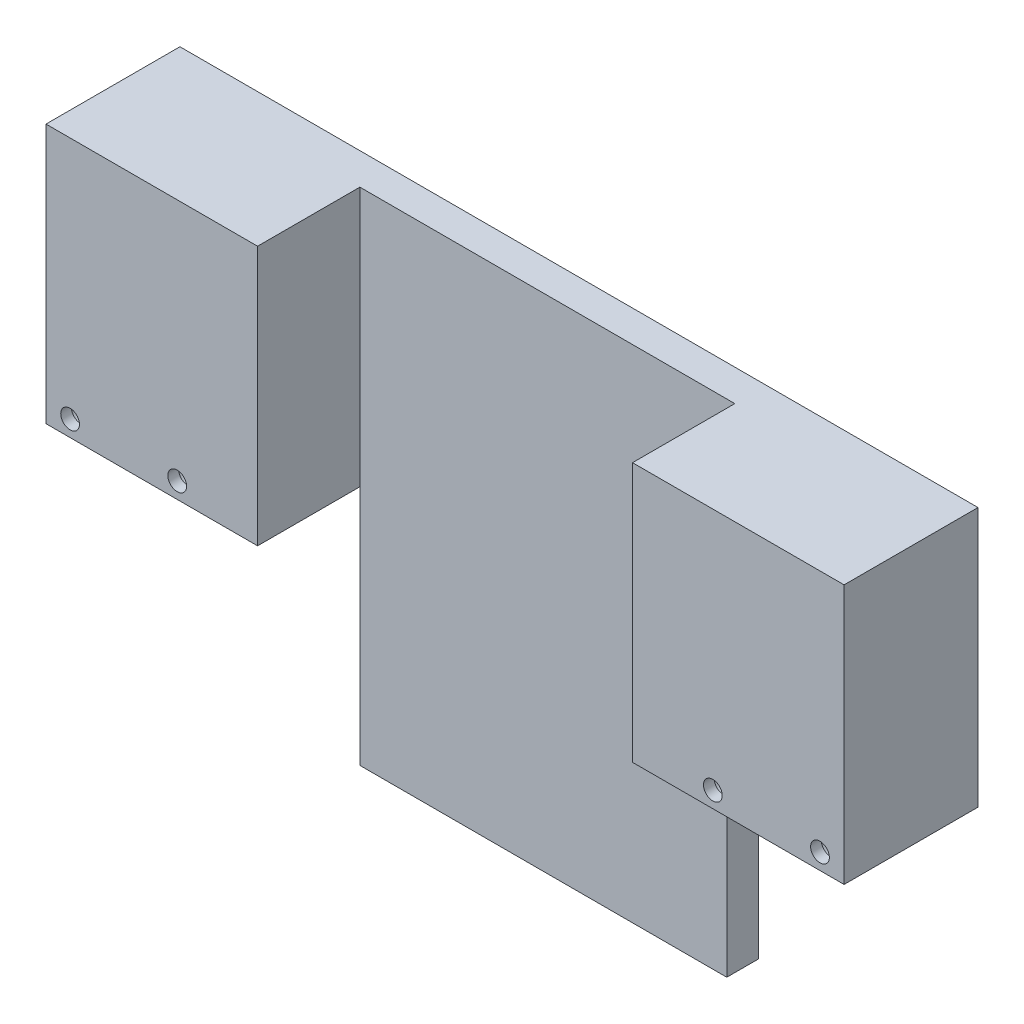
ISO-10303-21;
HEADER;
FILE_DESCRIPTION(('STEP AP214'),'2;1');
FILE_NAME('part.step','',(''),(''),'','','');
FILE_SCHEMA(('AUTOMOTIVE_DESIGN { 1 0 10303 214 1 1 1 1 }'));
ENDSEC;
DATA;
#1=APPLICATION_CONTEXT('core data for automotive mechanical design processes');
#2=APPLICATION_PROTOCOL_DEFINITION('international standard','automotive_design',2000,#1);
#3=PRODUCT_CONTEXT('',#1,'mechanical');
#4=PRODUCT('Part','Part','',(#3));
#5=PRODUCT_RELATED_PRODUCT_CATEGORY('part','',(#4));
#6=PRODUCT_DEFINITION_FORMATION('','',#4);
#7=PRODUCT_DEFINITION_CONTEXT('part definition',#1,'design');
#8=PRODUCT_DEFINITION('design','',#6,#7);
#9=PRODUCT_DEFINITION_SHAPE('','',#8);
#10=(LENGTH_UNIT() NAMED_UNIT(*) SI_UNIT(.MILLI.,.METRE.));
#11=(NAMED_UNIT(*) PLANE_ANGLE_UNIT() SI_UNIT($,.RADIAN.));
#12=(NAMED_UNIT(*) SI_UNIT($,.STERADIAN.) SOLID_ANGLE_UNIT());
#13=UNCERTAINTY_MEASURE_WITH_UNIT(LENGTH_MEASURE(1.E-05),#10,'distance_accuracy_value','');
#14=(GEOMETRIC_REPRESENTATION_CONTEXT(3) GLOBAL_UNCERTAINTY_ASSIGNED_CONTEXT((#13)) GLOBAL_UNIT_ASSIGNED_CONTEXT((#10,
#11,#12)) REPRESENTATION_CONTEXT('',''));
#15=CARTESIAN_POINT('',(0.,0.,0.));
#16=DIRECTION('',(0.,0.,1.));
#17=DIRECTION('',(1.,0.,0.));
#18=AXIS2_PLACEMENT_3D('',#15,#16,#17);
#19=CARTESIAN_POINT('',(74.5,11.9999999990341,2.95));
#20=DIRECTION('',(0.,-1.,0.));
#21=DIRECTION('',(0.,0.,-1.));
#22=AXIS2_PLACEMENT_3D('',#19,#20,#21);
#23=CONICAL_SURFACE('',#22,1.62099999948896,1.0297442574772);
#24=CARTESIAN_POINT('',(74.4999999999436,12.9739950647831,2.95));
#25=VERTEX_POINT('',#24);
#26=VERTEX_LOOP('',#25);
#27=FACE_BOUND('',#26,.T.);
#28=CARTESIAN_POINT('',(74.5,12.,2.95));
#29=DIRECTION('',(0.,-1.,0.));
#30=DIRECTION('',(1.,0.,0.));
#31=AXIS2_PLACEMENT_3D('',#28,#29,#30);
#32=CIRCLE('',#31,1.621);
#33=CARTESIAN_POINT('',(76.121,12.,2.95));
#34=VERTEX_POINT('',#33);
#35=EDGE_CURVE('E140',#34,#34,#32,.T.);
#36=ORIENTED_EDGE('',*,*,#35,.T.);
#37=EDGE_LOOP('',(#36));
#38=FACE_BOUND('',#37,.T.);
#39=ADVANCED_FACE('F16',(#27,#38),#23,.F.);
#40=CARTESIAN_POINT('',(4.50000000000001,48.05,189.174562050959));
#41=DIRECTION('',(0.,0.,-1.));
#42=DIRECTION('',(-1.,0.,0.));
#43=AXIS2_PLACEMENT_3D('',#40,#41,#42);
#44=CYLINDRICAL_SURFACE('',#43,1.75);
#45=CARTESIAN_POINT('',(4.50000000000001,48.05,23.));
#46=DIRECTION('',(0.,0.,-1.));
#47=DIRECTION('',(-1.,0.,0.));
#48=AXIS2_PLACEMENT_3D('',#45,#46,#47);
#49=CIRCLE('',#48,1.75);
#50=CARTESIAN_POINT('',(2.75000000000001,48.05,23.));
#51=VERTEX_POINT('',#50);
#52=EDGE_CURVE('E206',#51,#51,#49,.F.);
#53=ORIENTED_EDGE('',*,*,#52,.F.);
#54=EDGE_LOOP('',(#53));
#55=FACE_BOUND('',#54,.T.);
#56=CARTESIAN_POINT('',(4.50000000000001,48.05,25.));
#57=DIRECTION('',(0.,0.,-1.));
#58=DIRECTION('',(-1.,0.,0.));
#59=AXIS2_PLACEMENT_3D('',#56,#57,#58);
#60=CIRCLE('',#59,1.75);
#61=CARTESIAN_POINT('',(2.75000000000001,48.05,25.));
#62=VERTEX_POINT('',#61);
#63=EDGE_CURVE('E147',#62,#62,#60,.T.);
#64=ORIENTED_EDGE('',*,*,#63,.F.);
#65=EDGE_LOOP('',(#64));
#66=FACE_BOUND('',#65,.T.);
#67=ADVANCED_FACE('F231',(#55,#66),#44,.F.);
#68=CARTESIAN_POINT('',(24.5,48.05,189.174562050959));
#69=DIRECTION('',(0.,0.,-1.));
#70=DIRECTION('',(-1.,0.,0.));
#71=AXIS2_PLACEMENT_3D('',#68,#69,#70);
#72=CYLINDRICAL_SURFACE('',#71,1.75);
#73=CARTESIAN_POINT('',(24.5,48.05,23.));
#74=DIRECTION('',(0.,0.,-1.));
#75=DIRECTION('',(-1.,0.,0.));
#76=AXIS2_PLACEMENT_3D('',#73,#74,#75);
#77=CIRCLE('',#76,1.75);
#78=CARTESIAN_POINT('',(22.75,48.05,23.));
#79=VERTEX_POINT('',#78);
#80=EDGE_CURVE('E201',#79,#79,#77,.F.);
#81=ORIENTED_EDGE('',*,*,#80,.F.);
#82=EDGE_LOOP('',(#81));
#83=FACE_BOUND('',#82,.T.);
#84=CARTESIAN_POINT('',(24.5,48.05,25.));
#85=DIRECTION('',(0.,0.,-1.));
#86=DIRECTION('',(-1.,0.,0.));
#87=AXIS2_PLACEMENT_3D('',#84,#85,#86);
#88=CIRCLE('',#87,1.75);
#89=CARTESIAN_POINT('',(22.75,48.05,25.));
#90=VERTEX_POINT('',#89);
#91=EDGE_CURVE('E143',#90,#90,#88,.T.);
#92=ORIENTED_EDGE('',*,*,#91,.F.);
#93=EDGE_LOOP('',(#92));
#94=FACE_BOUND('',#93,.T.);
#95=ADVANCED_FACE('F233',(#83,#94),#72,.F.);
#96=CARTESIAN_POINT('',(124.5,48.05,189.174562050959));
#97=DIRECTION('',(0.,0.,-1.));
#98=DIRECTION('',(-1.,0.,0.));
#99=AXIS2_PLACEMENT_3D('',#96,#97,#98);
#100=CYLINDRICAL_SURFACE('',#99,1.75);
#101=CARTESIAN_POINT('',(124.5,48.05,23.));
#102=DIRECTION('',(0.,0.,-1.));
#103=DIRECTION('',(-1.,0.,0.));
#104=AXIS2_PLACEMENT_3D('',#101,#102,#103);
#105=CIRCLE('',#104,1.75);
#106=CARTESIAN_POINT('',(122.75,48.05,23.));
#107=VERTEX_POINT('',#106);
#108=EDGE_CURVE('E196',#107,#107,#105,.F.);
#109=ORIENTED_EDGE('',*,*,#108,.F.);
#110=EDGE_LOOP('',(#109));
#111=FACE_BOUND('',#110,.T.);
#112=CARTESIAN_POINT('',(124.5,48.05,25.));
#113=DIRECTION('',(0.,0.,-1.));
#114=DIRECTION('',(-1.,0.,0.));
#115=AXIS2_PLACEMENT_3D('',#112,#113,#114);
#116=CIRCLE('',#115,1.75);
#117=CARTESIAN_POINT('',(122.75,48.05,25.));
#118=VERTEX_POINT('',#117);
#119=EDGE_CURVE('E122',#118,#118,#116,.T.);
#120=ORIENTED_EDGE('',*,*,#119,.F.);
#121=EDGE_LOOP('',(#120));
#122=FACE_BOUND('',#121,.T.);
#123=ADVANCED_FACE('F240',(#111,#122),#100,.F.);
#124=CARTESIAN_POINT('',(144.5,48.05,189.174562050959));
#125=DIRECTION('',(0.,0.,-1.));
#126=DIRECTION('',(-1.,0.,0.));
#127=AXIS2_PLACEMENT_3D('',#124,#125,#126);
#128=CYLINDRICAL_SURFACE('',#127,1.75);
#129=CARTESIAN_POINT('',(144.5,48.05,23.));
#130=DIRECTION('',(0.,0.,-1.));
#131=DIRECTION('',(-1.,0.,0.));
#132=AXIS2_PLACEMENT_3D('',#129,#130,#131);
#133=CIRCLE('',#132,1.75);
#134=CARTESIAN_POINT('',(142.75,48.05,23.));
#135=VERTEX_POINT('',#134);
#136=EDGE_CURVE('E133',#135,#135,#133,.F.);
#137=ORIENTED_EDGE('',*,*,#136,.F.);
#138=EDGE_LOOP('',(#137));
#139=FACE_BOUND('',#138,.T.);
#140=CARTESIAN_POINT('',(144.5,48.05,25.));
#141=DIRECTION('',(0.,0.,-1.));
#142=DIRECTION('',(-1.,0.,0.));
#143=AXIS2_PLACEMENT_3D('',#140,#141,#142);
#144=CIRCLE('',#143,1.75);
#145=CARTESIAN_POINT('',(142.75,48.05,25.));
#146=VERTEX_POINT('',#145);
#147=EDGE_CURVE('E211',#146,#146,#144,.T.);
#148=ORIENTED_EDGE('',*,*,#147,.F.);
#149=EDGE_LOOP('',(#148));
#150=FACE_BOUND('',#149,.T.);
#151=ADVANCED_FACE('F334',(#139,#150),#128,.F.);
#152=CARTESIAN_POINT('',(39.5,93.5,25.));
#153=DIRECTION('',(-1.,0.,0.));
#154=DIRECTION('',(0.,0.,1.));
#155=AXIS2_PLACEMENT_3D('',#152,#153,#154);
#156=PLANE('',#155);
#157=DIRECTION('',(0.,1.,0.));
#158=VECTOR('',#157,1.);
#159=CARTESIAN_POINT('',(39.5,46.75,5.9));
#160=LINE('',#159,#158);
#161=CARTESIAN_POINT('',(39.5,93.5,5.9));
#162=VERTEX_POINT('',#161);
#163=CARTESIAN_POINT('',(39.5,45.05,5.9));
#164=VERTEX_POINT('',#163);
#165=EDGE_CURVE('E136',#162,#164,#160,.F.);
#166=ORIENTED_EDGE('',*,*,#165,.F.);
#167=DIRECTION('',(0.,0.,1.));
#168=VECTOR('',#167,1.);
#169=CARTESIAN_POINT('',(39.5,93.5,0.));
#170=LINE('',#169,#168);
#171=CARTESIAN_POINT('',(39.5,93.5,25.));
#172=VERTEX_POINT('',#171);
#173=EDGE_CURVE('E418',#172,#162,#170,.F.);
#174=ORIENTED_EDGE('',*,*,#173,.F.);
#175=DIRECTION('',(0.,1.,0.));
#176=VECTOR('',#175,1.);
#177=CARTESIAN_POINT('',(39.5,46.75,25.));
#178=LINE('',#177,#176);
#179=CARTESIAN_POINT('',(39.5,45.05,25.));
#180=VERTEX_POINT('',#179);
#181=EDGE_CURVE('E146',#180,#172,#178,.T.);
#182=ORIENTED_EDGE('',*,*,#181,.F.);
#183=DIRECTION('',(0.,0.,1.));
#184=VECTOR('',#183,1.);
#185=CARTESIAN_POINT('',(39.5,45.05,0.));
#186=LINE('',#185,#184);
#187=EDGE_CURVE('E410',#180,#164,#186,.F.);
#188=ORIENTED_EDGE('',*,*,#187,.T.);
#189=EDGE_LOOP('',(#166,#174,#182,#188));
#190=FACE_BOUND('',#189,.T.);
#191=ADVANCED_FACE('F330',(#190),#156,.F.);
#192=CARTESIAN_POINT('',(74.5,46.75,25.));
#193=DIRECTION('',(0.,0.,1.));
#194=DIRECTION('',(1.,0.,0.));
#195=AXIS2_PLACEMENT_3D('',#192,#193,#194);
#196=PLANE('',#195);
#197=ORIENTED_EDGE('',*,*,#91,.T.);
#198=EDGE_LOOP('',(#197));
#199=FACE_BOUND('',#198,.T.);
#200=ORIENTED_EDGE('',*,*,#63,.T.);
#201=EDGE_LOOP('',(#200));
#202=FACE_BOUND('',#201,.T.);
#203=DIRECTION('',(1.,0.,0.));
#204=VECTOR('',#203,1.);
#205=CARTESIAN_POINT('',(0.,93.5,25.));
#206=LINE('',#205,#204);
#207=CARTESIAN_POINT('',(0.,93.5,25.));
#208=VERTEX_POINT('',#207);
#209=EDGE_CURVE('E129',#208,#172,#206,.T.);
#210=ORIENTED_EDGE('',*,*,#209,.F.);
#211=DIRECTION('',(0.,1.,0.));
#212=VECTOR('',#211,1.);
#213=CARTESIAN_POINT('',(0.,0.,25.));
#214=LINE('',#213,#212);
#215=CARTESIAN_POINT('',(0.,45.05,25.));
#216=VERTEX_POINT('',#215);
#217=EDGE_CURVE('E415',#216,#208,#214,.T.);
#218=ORIENTED_EDGE('',*,*,#217,.F.);
#219=DIRECTION('',(1.,0.,0.));
#220=VECTOR('',#219,1.);
#221=CARTESIAN_POINT('',(0.,45.05,25.));
#222=LINE('',#221,#220);
#223=EDGE_CURVE('E404',#216,#180,#222,.T.);
#224=ORIENTED_EDGE('',*,*,#223,.T.);
#225=ORIENTED_EDGE('',*,*,#181,.T.);
#226=EDGE_LOOP('',(#210,#218,#224,#225));
#227=FACE_BOUND('',#226,.T.);
#228=ADVANCED_FACE('F228',(#199,#202,#227),#196,.T.);
#229=CARTESIAN_POINT('',(74.5,6.,2.95));
#230=DIRECTION('',(0.,-1.,0.));
#231=DIRECTION('',(1.,0.,0.));
#232=AXIS2_PLACEMENT_3D('',#229,#230,#231);
#233=CYLINDRICAL_SURFACE('',#232,1.621);
#234=ORIENTED_EDGE('',*,*,#35,.F.);
#235=EDGE_LOOP('',(#234));
#236=FACE_BOUND('',#235,.T.);
#237=CARTESIAN_POINT('',(74.5,0.,2.95));
#238=DIRECTION('',(0.,-1.,0.));
#239=DIRECTION('',(1.,0.,0.));
#240=AXIS2_PLACEMENT_3D('',#237,#238,#239);
#241=CIRCLE('',#240,1.621);
#242=CARTESIAN_POINT('',(76.121,0.,2.95));
#243=VERTEX_POINT('',#242);
#244=EDGE_CURVE('E187',#243,#243,#241,.F.);
#245=ORIENTED_EDGE('',*,*,#244,.F.);
#246=EDGE_LOOP('',(#245));
#247=FACE_BOUND('',#246,.T.);
#248=ADVANCED_FACE('F323',(#236,#247),#233,.F.);
#249=CARTESIAN_POINT('',(74.5,46.75,5.9));
#250=DIRECTION('',(0.,0.,1.));
#251=DIRECTION('',(1.,0.,0.));
#252=AXIS2_PLACEMENT_3D('',#249,#250,#251);
#253=PLANE('',#252);
#254=DIRECTION('',(1.,0.,0.));
#255=VECTOR('',#254,1.);
#256=CARTESIAN_POINT('',(149.,0.,5.9));
#257=LINE('',#256,#255);
#258=CARTESIAN_POINT('',(108.,0.,5.9));
#259=VERTEX_POINT('',#258);
#260=CARTESIAN_POINT('',(39.5,0.,5.9));
#261=VERTEX_POINT('',#260);
#262=EDGE_CURVE('E396',#259,#261,#257,.F.);
#263=ORIENTED_EDGE('',*,*,#262,.F.);
#264=DIRECTION('',(0.,1.,0.));
#265=VECTOR('',#264,1.);
#266=CARTESIAN_POINT('',(108.,0.,5.9));
#267=LINE('',#266,#265);
#268=CARTESIAN_POINT('',(108.,45.05,5.9));
#269=VERTEX_POINT('',#268);
#270=EDGE_CURVE('E391',#259,#269,#267,.T.);
#271=ORIENTED_EDGE('',*,*,#270,.T.);
#272=DIRECTION('',(1.,0.,0.));
#273=VECTOR('',#272,1.);
#274=CARTESIAN_POINT('',(74.5,45.05,5.9));
#275=LINE('',#274,#273);
#276=CARTESIAN_POINT('',(109.5,45.05,5.9));
#277=VERTEX_POINT('',#276);
#278=EDGE_CURVE('E138',#269,#277,#275,.T.);
#279=ORIENTED_EDGE('',*,*,#278,.T.);
#280=DIRECTION('',(0.,1.,0.));
#281=VECTOR('',#280,1.);
#282=CARTESIAN_POINT('',(109.5,0.,5.9));
#283=LINE('',#282,#281);
#284=CARTESIAN_POINT('',(109.5,93.5,5.9));
#285=VERTEX_POINT('',#284);
#286=EDGE_CURVE('E123',#277,#285,#283,.T.);
#287=ORIENTED_EDGE('',*,*,#286,.T.);
#288=DIRECTION('',(1.,0.,0.));
#289=VECTOR('',#288,1.);
#290=CARTESIAN_POINT('',(0.,93.5,5.9));
#291=LINE('',#290,#289);
#292=EDGE_CURVE('E109',#162,#285,#291,.T.);
#293=ORIENTED_EDGE('',*,*,#292,.F.);
#294=ORIENTED_EDGE('',*,*,#165,.T.);
#295=DIRECTION('',(0.,1.,0.));
#296=VECTOR('',#295,1.);
#297=CARTESIAN_POINT('',(39.5,45.05,5.9));
#298=LINE('',#297,#296);
#299=EDGE_CURVE('E398',#164,#261,#298,.F.);
#300=ORIENTED_EDGE('',*,*,#299,.T.);
#301=EDGE_LOOP('',(#263,#271,#279,#287,#293,#294,#300));
#302=FACE_BOUND('',#301,.T.);
#303=ADVANCED_FACE('F320',(#302),#253,.T.);
#304=CARTESIAN_POINT('',(109.5,0.,25.));
#305=DIRECTION('',(1.,0.,0.));
#306=DIRECTION('',(0.,0.,-1.));
#307=AXIS2_PLACEMENT_3D('',#304,#305,#306);
#308=PLANE('',#307);
#309=DIRECTION('',(0.,1.,0.));
#310=VECTOR('',#309,1.);
#311=CARTESIAN_POINT('',(109.5,46.75,25.));
#312=LINE('',#311,#310);
#313=CARTESIAN_POINT('',(109.5,93.5,25.));
#314=VERTEX_POINT('',#313);
#315=CARTESIAN_POINT('',(109.5,45.05,25.));
#316=VERTEX_POINT('',#315);
#317=EDGE_CURVE('E115',#314,#316,#312,.F.);
#318=ORIENTED_EDGE('',*,*,#317,.F.);
#319=DIRECTION('',(0.,0.,1.));
#320=VECTOR('',#319,1.);
#321=CARTESIAN_POINT('',(109.5,93.5,0.));
#322=LINE('',#321,#320);
#323=EDGE_CURVE('E102',#285,#314,#322,.T.);
#324=ORIENTED_EDGE('',*,*,#323,.F.);
#325=ORIENTED_EDGE('',*,*,#286,.F.);
#326=DIRECTION('',(0.,0.,1.));
#327=VECTOR('',#326,1.);
#328=CARTESIAN_POINT('',(109.5,45.05,0.));
#329=LINE('',#328,#327);
#330=EDGE_CURVE('E118',#277,#316,#329,.T.);
#331=ORIENTED_EDGE('',*,*,#330,.T.);
#332=EDGE_LOOP('',(#318,#324,#325,#331));
#333=FACE_BOUND('',#332,.T.);
#334=ADVANCED_FACE('F116',(#333),#308,.F.);
#335=CARTESIAN_POINT('',(74.5,46.75,25.));
#336=DIRECTION('',(0.,0.,1.));
#337=DIRECTION('',(1.,0.,0.));
#338=AXIS2_PLACEMENT_3D('',#335,#336,#337);
#339=PLANE('',#338);
#340=ORIENTED_EDGE('',*,*,#147,.T.);
#341=EDGE_LOOP('',(#340));
#342=FACE_BOUND('',#341,.T.);
#343=ORIENTED_EDGE('',*,*,#119,.T.);
#344=EDGE_LOOP('',(#343));
#345=FACE_BOUND('',#344,.T.);
#346=DIRECTION('',(1.,0.,0.));
#347=VECTOR('',#346,1.);
#348=CARTESIAN_POINT('',(0.,93.5,25.));
#349=LINE('',#348,#347);
#350=CARTESIAN_POINT('',(149.,93.5,25.));
#351=VERTEX_POINT('',#350);
#352=EDGE_CURVE('E106',#314,#351,#349,.T.);
#353=ORIENTED_EDGE('',*,*,#352,.F.);
#354=ORIENTED_EDGE('',*,*,#317,.T.);
#355=DIRECTION('',(1.,0.,0.));
#356=VECTOR('',#355,1.);
#357=CARTESIAN_POINT('',(108.,45.05,25.));
#358=LINE('',#357,#356);
#359=CARTESIAN_POINT('',(149.,45.05,25.));
#360=VERTEX_POINT('',#359);
#361=EDGE_CURVE('E388',#316,#360,#358,.T.);
#362=ORIENTED_EDGE('',*,*,#361,.T.);
#363=DIRECTION('',(0.,1.,0.));
#364=VECTOR('',#363,1.);
#365=CARTESIAN_POINT('',(149.,93.5,25.));
#366=LINE('',#365,#364);
#367=EDGE_CURVE('E112',#351,#360,#366,.F.);
#368=ORIENTED_EDGE('',*,*,#367,.F.);
#369=EDGE_LOOP('',(#353,#354,#362,#368));
#370=FACE_BOUND('',#369,.T.);
#371=ADVANCED_FACE('F125',(#342,#345,#370),#339,.T.);
#372=CARTESIAN_POINT('',(4.50000000000001,48.05,23.));
#373=DIRECTION('',(0.,0.,-1.));
#374=DIRECTION('',(-1.,0.,0.));
#375=AXIS2_PLACEMENT_3D('',#372,#373,#374);
#376=PLANE('',#375);
#377=ORIENTED_EDGE('',*,*,#52,.T.);
#378=EDGE_LOOP('',(#377));
#379=FACE_BOUND('',#378,.T.);
#380=CARTESIAN_POINT('',(4.50000000000001,48.05,23.));
#381=DIRECTION('',(0.,0.,-1.));
#382=DIRECTION('',(-1.,0.,0.));
#383=AXIS2_PLACEMENT_3D('',#380,#381,#382);
#384=CIRCLE('',#383,2.875);
#385=CARTESIAN_POINT('',(1.62500000000001,48.05,23.));
#386=VERTEX_POINT('',#385);
#387=EDGE_CURVE('E180',#386,#386,#384,.T.);
#388=ORIENTED_EDGE('',*,*,#387,.T.);
#389=EDGE_LOOP('',(#388));
#390=FACE_BOUND('',#389,.T.);
#391=ADVANCED_FACE('F310',(#379,#390),#376,.T.);
#392=CARTESIAN_POINT('',(24.5,48.05,23.));
#393=DIRECTION('',(0.,0.,-1.));
#394=DIRECTION('',(-1.,0.,0.));
#395=AXIS2_PLACEMENT_3D('',#392,#393,#394);
#396=PLANE('',#395);
#397=ORIENTED_EDGE('',*,*,#80,.T.);
#398=EDGE_LOOP('',(#397));
#399=FACE_BOUND('',#398,.T.);
#400=CARTESIAN_POINT('',(24.5,48.05,23.));
#401=DIRECTION('',(0.,0.,-1.));
#402=DIRECTION('',(-1.,0.,0.));
#403=AXIS2_PLACEMENT_3D('',#400,#401,#402);
#404=CIRCLE('',#403,2.875);
#405=CARTESIAN_POINT('',(21.625,48.05,23.));
#406=VERTEX_POINT('',#405);
#407=EDGE_CURVE('E175',#406,#406,#404,.T.);
#408=ORIENTED_EDGE('',*,*,#407,.T.);
#409=EDGE_LOOP('',(#408));
#410=FACE_BOUND('',#409,.T.);
#411=ADVANCED_FACE('F306',(#399,#410),#396,.T.);
#412=CARTESIAN_POINT('',(124.5,48.05,23.));
#413=DIRECTION('',(0.,0.,-1.));
#414=DIRECTION('',(-1.,0.,0.));
#415=AXIS2_PLACEMENT_3D('',#412,#413,#414);
#416=PLANE('',#415);
#417=ORIENTED_EDGE('',*,*,#108,.T.);
#418=EDGE_LOOP('',(#417));
#419=FACE_BOUND('',#418,.T.);
#420=CARTESIAN_POINT('',(124.5,48.05,23.));
#421=DIRECTION('',(0.,0.,-1.));
#422=DIRECTION('',(-1.,0.,0.));
#423=AXIS2_PLACEMENT_3D('',#420,#421,#422);
#424=CIRCLE('',#423,2.875);
#425=CARTESIAN_POINT('',(121.625,48.05,23.));
#426=VERTEX_POINT('',#425);
#427=EDGE_CURVE('E170',#426,#426,#424,.T.);
#428=ORIENTED_EDGE('',*,*,#427,.T.);
#429=EDGE_LOOP('',(#428));
#430=FACE_BOUND('',#429,.T.);
#431=ADVANCED_FACE('F302',(#419,#430),#416,.T.);
#432=CARTESIAN_POINT('',(144.5,48.05,23.));
#433=DIRECTION('',(0.,0.,-1.));
#434=DIRECTION('',(-1.,0.,0.));
#435=AXIS2_PLACEMENT_3D('',#432,#433,#434);
#436=PLANE('',#435);
#437=ORIENTED_EDGE('',*,*,#136,.T.);
#438=EDGE_LOOP('',(#437));
#439=FACE_BOUND('',#438,.T.);
#440=CARTESIAN_POINT('',(144.5,48.05,23.));
#441=DIRECTION('',(0.,0.,-1.));
#442=DIRECTION('',(-1.,0.,0.));
#443=AXIS2_PLACEMENT_3D('',#440,#441,#442);
#444=CIRCLE('',#443,2.875);
#445=CARTESIAN_POINT('',(141.625,48.05,23.));
#446=VERTEX_POINT('',#445);
#447=EDGE_CURVE('E166',#446,#446,#444,.T.);
#448=ORIENTED_EDGE('',*,*,#447,.T.);
#449=EDGE_LOOP('',(#448));
#450=FACE_BOUND('',#449,.T.);
#451=ADVANCED_FACE('F298',(#439,#450),#436,.T.);
#452=CARTESIAN_POINT('',(149.,93.5,0.));
#453=DIRECTION('',(1.,0.,0.));
#454=DIRECTION('',(0.,0.,-1.));
#455=AXIS2_PLACEMENT_3D('',#452,#453,#454);
#456=PLANE('',#455);
#457=DIRECTION('',(0.,0.,1.));
#458=VECTOR('',#457,1.);
#459=CARTESIAN_POINT('',(149.,93.5,0.));
#460=LINE('',#459,#458);
#461=CARTESIAN_POINT('',(149.,93.5,0.));
#462=VERTEX_POINT('',#461);
#463=EDGE_CURVE('E127',#351,#462,#460,.F.);
#464=ORIENTED_EDGE('',*,*,#463,.F.);
#465=ORIENTED_EDGE('',*,*,#367,.T.);
#466=DIRECTION('',(0.,0.,1.));
#467=VECTOR('',#466,1.);
#468=CARTESIAN_POINT('',(149.,45.05,0.));
#469=LINE('',#468,#467);
#470=CARTESIAN_POINT('',(149.,45.05,0.));
#471=VERTEX_POINT('',#470);
#472=EDGE_CURVE('E385',#360,#471,#469,.F.);
#473=ORIENTED_EDGE('',*,*,#472,.T.);
#474=DIRECTION('',(0.,1.,0.));
#475=VECTOR('',#474,1.);
#476=CARTESIAN_POINT('',(149.,46.75,0.));
#477=LINE('',#476,#475);
#478=EDGE_CURVE('E169',#471,#462,#477,.T.);
#479=ORIENTED_EDGE('',*,*,#478,.T.);
#480=EDGE_LOOP('',(#464,#465,#473,#479));
#481=FACE_BOUND('',#480,.T.);
#482=ADVANCED_FACE('F295',(#481),#456,.T.);
#483=CARTESIAN_POINT('',(0.,93.5,0.));
#484=DIRECTION('',(0.,1.,0.));
#485=DIRECTION('',(0.,0.,1.));
#486=AXIS2_PLACEMENT_3D('',#483,#484,#485);
#487=PLANE('',#486);
#488=ORIENTED_EDGE('',*,*,#173,.T.);
#489=ORIENTED_EDGE('',*,*,#292,.T.);
#490=ORIENTED_EDGE('',*,*,#323,.T.);
#491=ORIENTED_EDGE('',*,*,#352,.T.);
#492=ORIENTED_EDGE('',*,*,#463,.T.);
#493=DIRECTION('',(1.,0.,0.));
#494=VECTOR('',#493,1.);
#495=CARTESIAN_POINT('',(74.5,93.5,0.));
#496=LINE('',#495,#494);
#497=CARTESIAN_POINT('',(0.,93.5,0.));
#498=VERTEX_POINT('',#497);
#499=EDGE_CURVE('E379',#462,#498,#496,.F.);
#500=ORIENTED_EDGE('',*,*,#499,.T.);
#501=DIRECTION('',(0.,0.,1.));
#502=VECTOR('',#501,1.);
#503=CARTESIAN_POINT('',(0.,93.5,0.));
#504=LINE('',#503,#502);
#505=EDGE_CURVE('E413',#208,#498,#504,.F.);
#506=ORIENTED_EDGE('',*,*,#505,.F.);
#507=ORIENTED_EDGE('',*,*,#209,.T.);
#508=EDGE_LOOP('',(#488,#489,#490,#491,#492,#500,#506,#507));
#509=FACE_BOUND('',#508,.T.);
#510=ADVANCED_FACE('F104',(#509),#487,.T.);
#511=CARTESIAN_POINT('',(0.,0.,0.));
#512=DIRECTION('',(-1.,0.,0.));
#513=DIRECTION('',(0.,0.,1.));
#514=AXIS2_PLACEMENT_3D('',#511,#512,#513);
#515=PLANE('',#514);
#516=ORIENTED_EDGE('',*,*,#505,.T.);
#517=DIRECTION('',(0.,1.,0.));
#518=VECTOR('',#517,1.);
#519=CARTESIAN_POINT('',(0.,46.75,0.));
#520=LINE('',#519,#518);
#521=CARTESIAN_POINT('',(0.,45.05,0.));
#522=VERTEX_POINT('',#521);
#523=EDGE_CURVE('E376',#498,#522,#520,.F.);
#524=ORIENTED_EDGE('',*,*,#523,.T.);
#525=DIRECTION('',(0.,0.,1.));
#526=VECTOR('',#525,1.);
#527=CARTESIAN_POINT('',(0.,45.05,0.));
#528=LINE('',#527,#526);
#529=EDGE_CURVE('E407',#522,#216,#528,.T.);
#530=ORIENTED_EDGE('',*,*,#529,.T.);
#531=ORIENTED_EDGE('',*,*,#217,.T.);
#532=EDGE_LOOP('',(#516,#524,#530,#531));
#533=FACE_BOUND('',#532,.T.);
#534=ADVANCED_FACE('F288',(#533),#515,.T.);
#535=CARTESIAN_POINT('',(0.,45.05,0.));
#536=DIRECTION('',(0.,1.,0.));
#537=DIRECTION('',(0.,0.,1.));
#538=AXIS2_PLACEMENT_3D('',#535,#536,#537);
#539=PLANE('',#538);
#540=ORIENTED_EDGE('',*,*,#529,.F.);
#541=DIRECTION('',(1.,0.,0.));
#542=VECTOR('',#541,1.);
#543=CARTESIAN_POINT('',(74.5,45.05,0.));
#544=LINE('',#543,#542);
#545=CARTESIAN_POINT('',(39.5,45.05,0.));
#546=VERTEX_POINT('',#545);
#547=EDGE_CURVE('E370',#522,#546,#544,.T.);
#548=ORIENTED_EDGE('',*,*,#547,.T.);
#549=DIRECTION('',(0.,0.,-1.));
#550=VECTOR('',#549,1.);
#551=CARTESIAN_POINT('',(39.5,45.05,0.));
#552=LINE('',#551,#550);
#553=EDGE_CURVE('E401',#546,#164,#552,.F.);
#554=ORIENTED_EDGE('',*,*,#553,.T.);
#555=ORIENTED_EDGE('',*,*,#187,.F.);
#556=ORIENTED_EDGE('',*,*,#223,.F.);
#557=EDGE_LOOP('',(#540,#548,#554,#555,#556));
#558=FACE_BOUND('',#557,.T.);
#559=ADVANCED_FACE('F284',(#558),#539,.F.);
#560=CARTESIAN_POINT('',(39.5,45.05,0.));
#561=DIRECTION('',(1.,0.,0.));
#562=DIRECTION('',(0.,0.,-1.));
#563=AXIS2_PLACEMENT_3D('',#560,#561,#562);
#564=PLANE('',#563);
#565=ORIENTED_EDGE('',*,*,#553,.F.);
#566=DIRECTION('',(0.,1.,0.));
#567=VECTOR('',#566,1.);
#568=CARTESIAN_POINT('',(39.5,46.75,0.));
#569=LINE('',#568,#567);
#570=CARTESIAN_POINT('',(39.5,0.,0.));
#571=VERTEX_POINT('',#570);
#572=EDGE_CURVE('E368',#546,#571,#569,.F.);
#573=ORIENTED_EDGE('',*,*,#572,.T.);
#574=DIRECTION('',(0.,0.,-1.));
#575=VECTOR('',#574,1.);
#576=CARTESIAN_POINT('',(39.5,0.,0.));
#577=LINE('',#576,#575);
#578=EDGE_CURVE('E191',#261,#571,#577,.T.);
#579=ORIENTED_EDGE('',*,*,#578,.F.);
#580=ORIENTED_EDGE('',*,*,#299,.F.);
#581=EDGE_LOOP('',(#565,#573,#579,#580));
#582=FACE_BOUND('',#581,.T.);
#583=ADVANCED_FACE('F280',(#582),#564,.F.);
#584=CARTESIAN_POINT('',(149.,0.,0.));
#585=DIRECTION('',(0.,-1.,0.));
#586=DIRECTION('',(0.,0.,-1.));
#587=AXIS2_PLACEMENT_3D('',#584,#585,#586);
#588=PLANE('',#587);
#589=ORIENTED_EDGE('',*,*,#244,.T.);
#590=EDGE_LOOP('',(#589));
#591=FACE_BOUND('',#590,.T.);
#592=ORIENTED_EDGE('',*,*,#578,.T.);
#593=DIRECTION('',(1.,0.,0.));
#594=VECTOR('',#593,1.);
#595=CARTESIAN_POINT('',(74.5,0.,0.));
#596=LINE('',#595,#594);
#597=CARTESIAN_POINT('',(108.,0.,0.));
#598=VERTEX_POINT('',#597);
#599=EDGE_CURVE('E362',#571,#598,#596,.T.);
#600=ORIENTED_EDGE('',*,*,#599,.T.);
#601=DIRECTION('',(0.,0.,1.));
#602=VECTOR('',#601,1.);
#603=CARTESIAN_POINT('',(108.,0.,0.));
#604=LINE('',#603,#602);
#605=EDGE_CURVE('E190',#598,#259,#604,.T.);
#606=ORIENTED_EDGE('',*,*,#605,.T.);
#607=ORIENTED_EDGE('',*,*,#262,.T.);
#608=EDGE_LOOP('',(#592,#600,#606,#607));
#609=FACE_BOUND('',#608,.T.);
#610=ADVANCED_FACE('F276',(#591,#609),#588,.T.);
#611=CARTESIAN_POINT('',(108.,0.,0.));
#612=DIRECTION('',(-1.,0.,0.));
#613=DIRECTION('',(0.,0.,1.));
#614=AXIS2_PLACEMENT_3D('',#611,#612,#613);
#615=PLANE('',#614);
#616=ORIENTED_EDGE('',*,*,#605,.F.);
#617=DIRECTION('',(0.,1.,0.));
#618=VECTOR('',#617,1.);
#619=CARTESIAN_POINT('',(108.,46.75,0.));
#620=LINE('',#619,#618);
#621=CARTESIAN_POINT('',(108.,45.05,0.));
#622=VERTEX_POINT('',#621);
#623=EDGE_CURVE('E359',#598,#622,#620,.T.);
#624=ORIENTED_EDGE('',*,*,#623,.T.);
#625=DIRECTION('',(0.,0.,1.));
#626=VECTOR('',#625,1.);
#627=CARTESIAN_POINT('',(108.,45.05,0.));
#628=LINE('',#627,#626);
#629=EDGE_CURVE('E34',#622,#269,#628,.T.);
#630=ORIENTED_EDGE('',*,*,#629,.T.);
#631=ORIENTED_EDGE('',*,*,#270,.F.);
#632=EDGE_LOOP('',(#616,#624,#630,#631));
#633=FACE_BOUND('',#632,.T.);
#634=ADVANCED_FACE('F273',(#633),#615,.F.);
#635=CARTESIAN_POINT('',(108.,45.05,0.));
#636=DIRECTION('',(0.,1.,0.));
#637=DIRECTION('',(0.,0.,1.));
#638=AXIS2_PLACEMENT_3D('',#635,#636,#637);
#639=PLANE('',#638);
#640=ORIENTED_EDGE('',*,*,#629,.F.);
#641=DIRECTION('',(1.,0.,0.));
#642=VECTOR('',#641,1.);
#643=CARTESIAN_POINT('',(74.5,45.05,0.));
#644=LINE('',#643,#642);
#645=EDGE_CURVE('E163',#622,#471,#644,.T.);
#646=ORIENTED_EDGE('',*,*,#645,.T.);
#647=ORIENTED_EDGE('',*,*,#472,.F.);
#648=ORIENTED_EDGE('',*,*,#361,.F.);
#649=ORIENTED_EDGE('',*,*,#330,.F.);
#650=ORIENTED_EDGE('',*,*,#278,.F.);
#651=EDGE_LOOP('',(#640,#646,#647,#648,#649,#650));
#652=FACE_BOUND('',#651,.T.);
#653=ADVANCED_FACE('F269',(#652),#639,.F.);
#654=CARTESIAN_POINT('',(4.50000000000001,48.05,11.5));
#655=DIRECTION('',(0.,0.,-1.));
#656=DIRECTION('',(-1.,0.,0.));
#657=AXIS2_PLACEMENT_3D('',#654,#655,#656);
#658=CYLINDRICAL_SURFACE('',#657,2.875);
#659=ORIENTED_EDGE('',*,*,#387,.F.);
#660=EDGE_LOOP('',(#659));
#661=FACE_BOUND('',#660,.T.);
#662=CARTESIAN_POINT('',(4.50000000000001,48.05,0.));
#663=DIRECTION('',(0.,0.,-1.));
#664=DIRECTION('',(-1.,0.,0.));
#665=AXIS2_PLACEMENT_3D('',#662,#663,#664);
#666=CIRCLE('',#665,2.875);
#667=CARTESIAN_POINT('',(1.62500000000001,48.05,0.));
#668=VERTEX_POINT('',#667);
#669=EDGE_CURVE('E158',#668,#668,#666,.T.);
#670=ORIENTED_EDGE('',*,*,#669,.T.);
#671=EDGE_LOOP('',(#670));
#672=FACE_BOUND('',#671,.T.);
#673=ADVANCED_FACE('F265',(#661,#672),#658,.F.);
#674=CARTESIAN_POINT('',(24.5,48.05,11.5));
#675=DIRECTION('',(0.,0.,-1.));
#676=DIRECTION('',(-1.,0.,0.));
#677=AXIS2_PLACEMENT_3D('',#674,#675,#676);
#678=CYLINDRICAL_SURFACE('',#677,2.875);
#679=ORIENTED_EDGE('',*,*,#407,.F.);
#680=EDGE_LOOP('',(#679));
#681=FACE_BOUND('',#680,.T.);
#682=CARTESIAN_POINT('',(24.5,48.05,0.));
#683=DIRECTION('',(0.,0.,-1.));
#684=DIRECTION('',(-1.,0.,0.));
#685=AXIS2_PLACEMENT_3D('',#682,#683,#684);
#686=CIRCLE('',#685,2.875);
#687=CARTESIAN_POINT('',(21.625,48.05,0.));
#688=VERTEX_POINT('',#687);
#689=EDGE_CURVE('E153',#688,#688,#686,.T.);
#690=ORIENTED_EDGE('',*,*,#689,.T.);
#691=EDGE_LOOP('',(#690));
#692=FACE_BOUND('',#691,.T.);
#693=ADVANCED_FACE('F261',(#681,#692),#678,.F.);
#694=CARTESIAN_POINT('',(124.5,48.05,11.5));
#695=DIRECTION('',(0.,0.,-1.));
#696=DIRECTION('',(-1.,0.,0.));
#697=AXIS2_PLACEMENT_3D('',#694,#695,#696);
#698=CYLINDRICAL_SURFACE('',#697,2.875);
#699=ORIENTED_EDGE('',*,*,#427,.F.);
#700=EDGE_LOOP('',(#699));
#701=FACE_BOUND('',#700,.T.);
#702=CARTESIAN_POINT('',(124.5,48.05,0.));
#703=DIRECTION('',(0.,0.,-1.));
#704=DIRECTION('',(-1.,0.,0.));
#705=AXIS2_PLACEMENT_3D('',#702,#703,#704);
#706=CIRCLE('',#705,2.875);
#707=CARTESIAN_POINT('',(121.625,48.05,0.));
#708=VERTEX_POINT('',#707);
#709=EDGE_CURVE('E25',#708,#708,#706,.T.);
#710=ORIENTED_EDGE('',*,*,#709,.T.);
#711=EDGE_LOOP('',(#710));
#712=FACE_BOUND('',#711,.T.);
#713=ADVANCED_FACE('F253',(#701,#712),#698,.F.);
#714=CARTESIAN_POINT('',(144.5,48.05,11.5));
#715=DIRECTION('',(0.,0.,-1.));
#716=DIRECTION('',(-1.,0.,0.));
#717=AXIS2_PLACEMENT_3D('',#714,#715,#716);
#718=CYLINDRICAL_SURFACE('',#717,2.875);
#719=ORIENTED_EDGE('',*,*,#447,.F.);
#720=EDGE_LOOP('',(#719));
#721=FACE_BOUND('',#720,.T.);
#722=CARTESIAN_POINT('',(144.5,48.05,0.));
#723=DIRECTION('',(0.,0.,-1.));
#724=DIRECTION('',(-1.,0.,0.));
#725=AXIS2_PLACEMENT_3D('',#722,#723,#724);
#726=CIRCLE('',#725,2.875);
#727=CARTESIAN_POINT('',(141.625,48.05,0.));
#728=VERTEX_POINT('',#727);
#729=EDGE_CURVE('E10',#728,#728,#726,.T.);
#730=ORIENTED_EDGE('',*,*,#729,.T.);
#731=EDGE_LOOP('',(#730));
#732=FACE_BOUND('',#731,.T.);
#733=ADVANCED_FACE('F247',(#721,#732),#718,.F.);
#734=CARTESIAN_POINT('',(74.5,46.75,0.));
#735=DIRECTION('',(0.,0.,1.));
#736=DIRECTION('',(1.,0.,0.));
#737=AXIS2_PLACEMENT_3D('',#734,#735,#736);
#738=PLANE('',#737);
#739=ORIENTED_EDGE('',*,*,#729,.F.);
#740=EDGE_LOOP('',(#739));
#741=FACE_BOUND('',#740,.T.);
#742=ORIENTED_EDGE('',*,*,#709,.F.);
#743=EDGE_LOOP('',(#742));
#744=FACE_BOUND('',#743,.T.);
#745=ORIENTED_EDGE('',*,*,#689,.F.);
#746=EDGE_LOOP('',(#745));
#747=FACE_BOUND('',#746,.T.);
#748=ORIENTED_EDGE('',*,*,#669,.F.);
#749=EDGE_LOOP('',(#748));
#750=FACE_BOUND('',#749,.T.);
#751=ORIENTED_EDGE('',*,*,#623,.F.);
#752=ORIENTED_EDGE('',*,*,#599,.F.);
#753=ORIENTED_EDGE('',*,*,#572,.F.);
#754=ORIENTED_EDGE('',*,*,#547,.F.);
#755=ORIENTED_EDGE('',*,*,#523,.F.);
#756=ORIENTED_EDGE('',*,*,#499,.F.);
#757=ORIENTED_EDGE('',*,*,#478,.F.);
#758=ORIENTED_EDGE('',*,*,#645,.F.);
#759=EDGE_LOOP('',(#751,#752,#753,#754,#755,#756,#757,#758));
#760=FACE_BOUND('',#759,.T.);
#761=ADVANCED_FACE('F245',(#741,#744,#747,#750,#760),#738,.F.);
#762=CLOSED_SHELL('',(#39,#67,#95,#123,#151,#191,#228,#248,#303,#334,#371,#391,#411,#431,#451,
#482,#510,#534,#559,#583,#610,#634,#653,#673,#693,#713,#733,#761));
#763=MANIFOLD_SOLID_BREP('B1',#762);
#764=ADVANCED_BREP_SHAPE_REPRESENTATION('',(#18,#763),#14);
#765=SHAPE_DEFINITION_REPRESENTATION(#9,#764);
ENDSEC;
END-ISO-10303-21;
